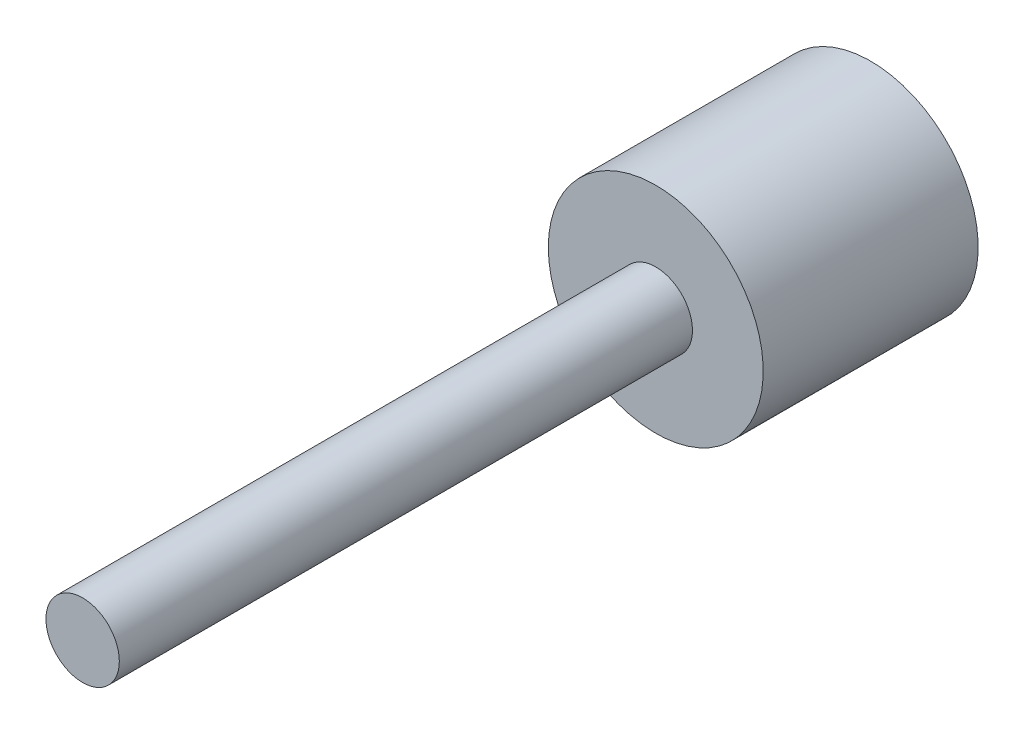
ISO-10303-21;
HEADER;
FILE_DESCRIPTION(('STEP AP214'),'2;1');
FILE_NAME('part.step','',(''),(''),'','','');
FILE_SCHEMA(('AUTOMOTIVE_DESIGN { 1 0 10303 214 1 1 1 1 }'));
ENDSEC;
DATA;
#1=APPLICATION_CONTEXT('core data for automotive mechanical design processes');
#2=APPLICATION_PROTOCOL_DEFINITION('international standard','automotive_design',2000,#1);
#3=PRODUCT_CONTEXT('',#1,'mechanical');
#4=PRODUCT('Part','Part','',(#3));
#5=PRODUCT_RELATED_PRODUCT_CATEGORY('part','',(#4));
#6=PRODUCT_DEFINITION_FORMATION('','',#4);
#7=PRODUCT_DEFINITION_CONTEXT('part definition',#1,'design');
#8=PRODUCT_DEFINITION('design','',#6,#7);
#9=PRODUCT_DEFINITION_SHAPE('','',#8);
#10=(LENGTH_UNIT() NAMED_UNIT(*) SI_UNIT(.MILLI.,.METRE.));
#11=(NAMED_UNIT(*) PLANE_ANGLE_UNIT() SI_UNIT($,.RADIAN.));
#12=(NAMED_UNIT(*) SI_UNIT($,.STERADIAN.) SOLID_ANGLE_UNIT());
#13=UNCERTAINTY_MEASURE_WITH_UNIT(LENGTH_MEASURE(1.E-05),#10,'distance_accuracy_value','');
#14=(GEOMETRIC_REPRESENTATION_CONTEXT(3) GLOBAL_UNCERTAINTY_ASSIGNED_CONTEXT((#13)) GLOBAL_UNIT_ASSIGNED_CONTEXT((#10,
#11,#12)) REPRESENTATION_CONTEXT('',''));
#15=CARTESIAN_POINT('',(0.,0.,0.));
#16=DIRECTION('',(0.,0.,1.));
#17=DIRECTION('',(1.,0.,0.));
#18=AXIS2_PLACEMENT_3D('',#15,#16,#17);
#19=CARTESIAN_POINT('',(0.,0.,38.1));
#20=DIRECTION('',(0.,0.,-1.));
#21=DIRECTION('',(-1.,0.,0.));
#22=AXIS2_PLACEMENT_3D('',#19,#20,#21);
#23=CYLINDRICAL_SURFACE('',#22,19.05);
#24=CARTESIAN_POINT('',(0.,0.,38.1));
#25=DIRECTION('',(0.,0.,1.));
#26=DIRECTION('',(1.,0.,0.));
#27=AXIS2_PLACEMENT_3D('',#24,#25,#26);
#28=CIRCLE('',#27,19.05);
#29=CARTESIAN_POINT('',(-19.05,0.,38.1));
#30=VERTEX_POINT('',#29);
#31=EDGE_CURVE('E51',#30,#30,#28,.T.);
#32=CARTESIAN_POINT('',(0.,0.,0.));
#33=DIRECTION('',(0.,0.,1.));
#34=DIRECTION('',(1.,0.,0.));
#35=AXIS2_PLACEMENT_3D('',#32,#33,#34);
#36=CIRCLE('',#35,19.05);
#37=CARTESIAN_POINT('',(-19.05,0.,0.));
#38=VERTEX_POINT('',#37);
#39=EDGE_CURVE('E46',#38,#38,#36,.T.);
#40=CARTESIAN_POINT('',(-19.05,0.,38.1));
#41=CARTESIAN_POINT('',(-19.05,0.,37.703125));
#42=CARTESIAN_POINT('',(-19.05,0.,37.30625));
#43=CARTESIAN_POINT('',(-19.05,0.,36.5125));
#44=CARTESIAN_POINT('',(-19.05,0.,36.115625));
#45=CARTESIAN_POINT('',(-19.05,0.,35.321875));
#46=CARTESIAN_POINT('',(-19.05,0.,34.925));
#47=CARTESIAN_POINT('',(-19.05,0.,34.13125));
#48=CARTESIAN_POINT('',(-19.05,0.,33.734375));
#49=CARTESIAN_POINT('',(-19.05,0.,32.940625));
#50=CARTESIAN_POINT('',(-19.05,0.,32.54375));
#51=CARTESIAN_POINT('',(-19.05,0.,31.75));
#52=CARTESIAN_POINT('',(-19.05,0.,31.353125));
#53=CARTESIAN_POINT('',(-19.05,0.,30.559375));
#54=CARTESIAN_POINT('',(-19.05,0.,30.1625));
#55=CARTESIAN_POINT('',(-19.05,0.,29.36875));
#56=CARTESIAN_POINT('',(-19.05,0.,28.971875));
#57=CARTESIAN_POINT('',(-19.05,0.,28.178125));
#58=CARTESIAN_POINT('',(-19.05,0.,27.78125));
#59=CARTESIAN_POINT('',(-19.05,0.,26.9875));
#60=CARTESIAN_POINT('',(-19.05,0.,26.590625));
#61=CARTESIAN_POINT('',(-19.05,0.,25.796875));
#62=CARTESIAN_POINT('',(-19.05,0.,25.4));
#63=CARTESIAN_POINT('',(-19.05,0.,24.60625));
#64=CARTESIAN_POINT('',(-19.05,0.,24.209375));
#65=CARTESIAN_POINT('',(-19.05,0.,23.415625));
#66=CARTESIAN_POINT('',(-19.05,0.,23.01875));
#67=CARTESIAN_POINT('',(-19.05,0.,22.225));
#68=CARTESIAN_POINT('',(-19.05,0.,21.828125));
#69=CARTESIAN_POINT('',(-19.05,0.,21.034375));
#70=CARTESIAN_POINT('',(-19.05,0.,20.6375));
#71=CARTESIAN_POINT('',(-19.05,0.,19.84375));
#72=CARTESIAN_POINT('',(-19.05,0.,19.446875));
#73=CARTESIAN_POINT('',(-19.05,0.,18.653125));
#74=CARTESIAN_POINT('',(-19.05,0.,18.25625));
#75=CARTESIAN_POINT('',(-19.05,0.,17.4625));
#76=CARTESIAN_POINT('',(-19.05,0.,17.065625));
#77=CARTESIAN_POINT('',(-19.05,0.,16.271875));
#78=CARTESIAN_POINT('',(-19.05,0.,15.875));
#79=CARTESIAN_POINT('',(-19.05,0.,15.08125));
#80=CARTESIAN_POINT('',(-19.05,0.,14.684375));
#81=CARTESIAN_POINT('',(-19.05,0.,13.890625));
#82=CARTESIAN_POINT('',(-19.05,0.,13.49375));
#83=CARTESIAN_POINT('',(-19.05,0.,12.7));
#84=CARTESIAN_POINT('',(-19.05,0.,12.303125));
#85=CARTESIAN_POINT('',(-19.05,0.,11.509375));
#86=CARTESIAN_POINT('',(-19.05,0.,11.1125));
#87=CARTESIAN_POINT('',(-19.05,0.,10.31875));
#88=CARTESIAN_POINT('',(-19.05,0.,9.92187499999999));
#89=CARTESIAN_POINT('',(-19.05,0.,9.128125));
#90=CARTESIAN_POINT('',(-19.05,0.,8.73124999999999));
#91=CARTESIAN_POINT('',(-19.05,0.,7.93749999999999));
#92=CARTESIAN_POINT('',(-19.05,0.,7.54062499999999));
#93=CARTESIAN_POINT('',(-19.05,0.,6.746875));
#94=CARTESIAN_POINT('',(-19.05,0.,6.35));
#95=CARTESIAN_POINT('',(-19.05,0.,5.55625));
#96=CARTESIAN_POINT('',(-19.05,0.,5.159375));
#97=CARTESIAN_POINT('',(-19.05,0.,4.365625));
#98=CARTESIAN_POINT('',(-19.05,0.,3.96875));
#99=CARTESIAN_POINT('',(-19.05,0.,3.175));
#100=CARTESIAN_POINT('',(-19.05,0.,2.778125));
#101=CARTESIAN_POINT('',(-19.05,0.,1.984375));
#102=CARTESIAN_POINT('',(-19.05,0.,1.5875));
#103=CARTESIAN_POINT('',(-19.05,0.,0.79375));
#104=CARTESIAN_POINT('',(-19.05,0.,0.396875));
#105=CARTESIAN_POINT('',(-19.05,0.,0.));
#106=B_SPLINE_CURVE_WITH_KNOTS('',3,(#40,#41,#42,#43,#44,#45,#46,#47,#48,#49,#50,#51,#52,#53,
#54,#55,#56,#57,#58,#59,#60,#61,#62,#63,#64,#65,#66,#67,#68,#69,#70,#71,#72,#73,#74,#75,#76,#77,
#78,#79,#80,#81,#82,#83,#84,#85,#86,#87,#88,#89,#90,#91,#92,#93,#94,#95,#96,#97,#98,#99,#100,
#101,#102,#103,#104,#105),.UNSPECIFIED.,.F.,.F.,(4,2,2,2,2,2,2,2,2,2,2,2,2,2,2,2,2,2,2,2,2,2,2,
2,2,2,2,2,2,2,2,2,4),(0.,1.190625,2.38125,3.571875,4.7625,5.953125,7.14375,8.334375,
9.52500000000001,10.715625,11.90625,13.096875,14.2875,15.478125,16.66875,17.859375,19.05,
20.240625,21.43125,22.621875,23.8125,25.003125,26.19375,27.384375,28.575,29.765625,30.95625,
32.146875,33.3375,34.528125,35.71875,36.909375,38.1),.UNSPECIFIED.);
#107=EDGE_CURVE('BSEAM43',#30,#38,#106,.T.);
#108=ORIENTED_EDGE('',*,*,#31,.F.);
#109=ORIENTED_EDGE('',*,*,#39,.T.);
#110=ORIENTED_EDGE('',*,*,#107,.T.);
#111=ORIENTED_EDGE('',*,*,#107,.F.);
#112=EDGE_LOOP('',(#108,#110,#109,#111));
#113=FACE_BOUND('',#112,.T.);
#114=ADVANCED_FACE('F43',(#113),#23,.T.);
#115=CARTESIAN_POINT('',(0.,0.,38.1));
#116=DIRECTION('',(0.,0.,1.));
#117=DIRECTION('',(1.,0.,0.));
#118=AXIS2_PLACEMENT_3D('',#115,#116,#117);
#119=PLANE('',#118);
#120=CARTESIAN_POINT('',(0.,0.,38.1));
#121=DIRECTION('',(0.,0.,1.));
#122=DIRECTION('',(1.,0.,0.));
#123=AXIS2_PLACEMENT_3D('',#120,#121,#122);
#124=CIRCLE('',#123,6.50527256555849);
#125=CARTESIAN_POINT('',(6.50527256555849,0.,38.1));
#126=VERTEX_POINT('',#125);
#127=EDGE_CURVE('E10',#126,#126,#124,.T.);
#128=ORIENTED_EDGE('',*,*,#127,.F.);
#129=EDGE_LOOP('',(#128));
#130=FACE_BOUND('',#129,.T.);
#131=ORIENTED_EDGE('',*,*,#31,.T.);
#132=EDGE_LOOP('',(#131));
#133=FACE_BOUND('',#132,.T.);
#134=ADVANCED_FACE('F71',(#130,#133),#119,.T.);
#135=CARTESIAN_POINT('',(0.,0.,0.));
#136=DIRECTION('',(0.,0.,1.));
#137=DIRECTION('',(1.,0.,0.));
#138=AXIS2_PLACEMENT_3D('',#135,#136,#137);
#139=PLANE('',#138);
#140=ORIENTED_EDGE('',*,*,#39,.F.);
#141=EDGE_LOOP('',(#140));
#142=FACE_BOUND('',#141,.T.);
#143=ADVANCED_FACE('F68',(#142),#139,.F.);
#144=CARTESIAN_POINT('',(0.,0.,139.7));
#145=DIRECTION('',(0.,0.,-1.));
#146=DIRECTION('',(-1.,0.,0.));
#147=AXIS2_PLACEMENT_3D('',#144,#145,#146);
#148=CYLINDRICAL_SURFACE('',#147,6.50527256555849);
#149=CARTESIAN_POINT('',(0.,0.,139.7));
#150=DIRECTION('',(0.,0.,1.));
#151=DIRECTION('',(1.,0.,0.));
#152=AXIS2_PLACEMENT_3D('',#149,#150,#151);
#153=CIRCLE('',#152,6.50527256555849);
#154=CARTESIAN_POINT('',(6.50527256555849,0.,139.7));
#155=VERTEX_POINT('',#154);
#156=EDGE_CURVE('E58',#155,#155,#153,.T.);
#157=ORIENTED_EDGE('',*,*,#156,.F.);
#158=EDGE_LOOP('',(#157));
#159=FACE_BOUND('',#158,.T.);
#160=ORIENTED_EDGE('',*,*,#127,.T.);
#161=EDGE_LOOP('',(#160));
#162=FACE_BOUND('',#161,.T.);
#163=ADVANCED_FACE('F70',(#159,#162),#148,.T.);
#164=CARTESIAN_POINT('',(0.,0.,139.7));
#165=DIRECTION('',(0.,0.,1.));
#166=DIRECTION('',(1.,0.,0.));
#167=AXIS2_PLACEMENT_3D('',#164,#165,#166);
#168=PLANE('',#167);
#169=ORIENTED_EDGE('',*,*,#156,.T.);
#170=EDGE_LOOP('',(#169));
#171=FACE_BOUND('',#170,.T.);
#172=ADVANCED_FACE('F77',(#171),#168,.T.);
#173=CLOSED_SHELL('',(#114,#134,#143,#163,#172));
#174=MANIFOLD_SOLID_BREP('B2',#173);
#175=ADVANCED_BREP_SHAPE_REPRESENTATION('',(#18,#174),#14);
#176=SHAPE_DEFINITION_REPRESENTATION(#9,#175);
ENDSEC;
END-ISO-10303-21;
